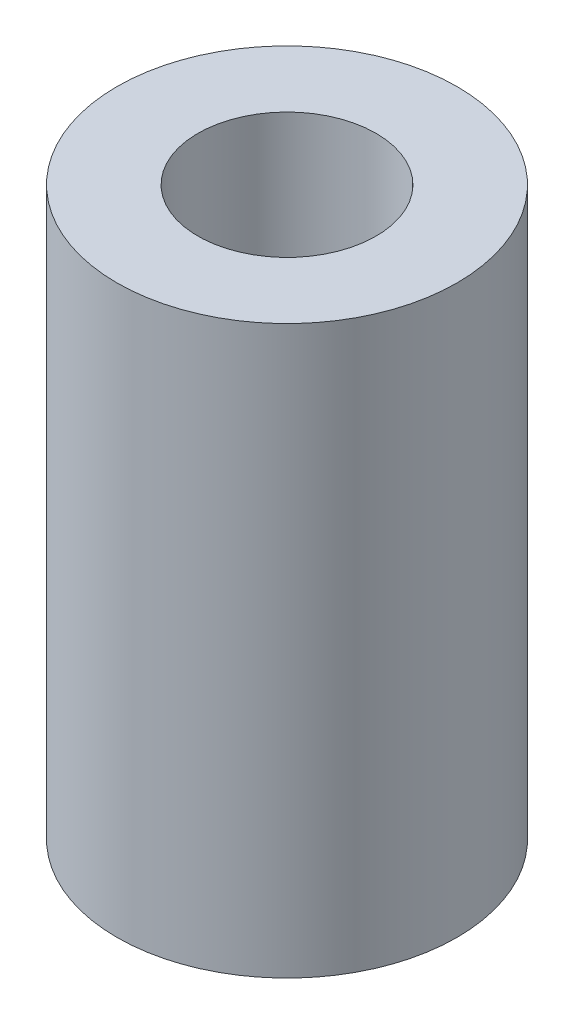
ISO-10303-21;
HEADER;
FILE_DESCRIPTION(('STEP AP214'),'2;1');
FILE_NAME('part.step','',(''),(''),'','','');
FILE_SCHEMA(('AUTOMOTIVE_DESIGN { 1 0 10303 214 1 1 1 1 }'));
ENDSEC;
DATA;
#1=APPLICATION_CONTEXT('core data for automotive mechanical design processes');
#2=APPLICATION_PROTOCOL_DEFINITION('international standard','automotive_design',2000,#1);
#3=PRODUCT_CONTEXT('',#1,'mechanical');
#4=PRODUCT('Part','Part','',(#3));
#5=PRODUCT_RELATED_PRODUCT_CATEGORY('part','',(#4));
#6=PRODUCT_DEFINITION_FORMATION('','',#4);
#7=PRODUCT_DEFINITION_CONTEXT('part definition',#1,'design');
#8=PRODUCT_DEFINITION('design','',#6,#7);
#9=PRODUCT_DEFINITION_SHAPE('','',#8);
#10=(LENGTH_UNIT() NAMED_UNIT(*) SI_UNIT(.MILLI.,.METRE.));
#11=(NAMED_UNIT(*) PLANE_ANGLE_UNIT() SI_UNIT($,.RADIAN.));
#12=(NAMED_UNIT(*) SI_UNIT($,.STERADIAN.) SOLID_ANGLE_UNIT());
#13=UNCERTAINTY_MEASURE_WITH_UNIT(LENGTH_MEASURE(1.E-05),#10,'distance_accuracy_value','');
#14=(GEOMETRIC_REPRESENTATION_CONTEXT(3) GLOBAL_UNCERTAINTY_ASSIGNED_CONTEXT((#13)) GLOBAL_UNIT_ASSIGNED_CONTEXT((#10,
#11,#12)) REPRESENTATION_CONTEXT('',''));
#15=CARTESIAN_POINT('',(0.,0.,0.));
#16=DIRECTION('',(0.,0.,1.));
#17=DIRECTION('',(1.,0.,0.));
#18=AXIS2_PLACEMENT_3D('',#15,#16,#17);
#19=CARTESIAN_POINT('',(0.,10.5,0.));
#20=DIRECTION('',(0.,1.,0.));
#21=DIRECTION('',(0.,0.,1.));
#22=AXIS2_PLACEMENT_3D('',#19,#20,#21);
#23=PLANE('',#22);
#24=CARTESIAN_POINT('',(0.,10.5,0.));
#25=DIRECTION('',(0.,1.,0.));
#26=DIRECTION('',(0.,0.,1.));
#27=AXIS2_PLACEMENT_3D('',#24,#25,#26);
#28=CIRCLE('',#27,3.15);
#29=CARTESIAN_POINT('',(0.,10.5,-3.15));
#30=VERTEX_POINT('',#29);
#31=EDGE_CURVE('E10',#30,#30,#28,.T.);
#32=ORIENTED_EDGE('',*,*,#31,.T.);
#33=EDGE_LOOP('',(#32));
#34=FACE_BOUND('',#33,.T.);
#35=CARTESIAN_POINT('',(0.,10.5,0.));
#36=DIRECTION('',(0.,1.,0.));
#37=DIRECTION('',(0.,0.,1.));
#38=AXIS2_PLACEMENT_3D('',#35,#36,#37);
#39=CIRCLE('',#38,1.65);
#40=CARTESIAN_POINT('',(0.,10.5,-1.65));
#41=VERTEX_POINT('',#40);
#42=EDGE_CURVE('E44',#41,#41,#39,.T.);
#43=ORIENTED_EDGE('',*,*,#42,.F.);
#44=EDGE_LOOP('',(#43));
#45=FACE_BOUND('',#44,.T.);
#46=ADVANCED_FACE('F33',(#34,#45),#23,.T.);
#47=CARTESIAN_POINT('',(0.,0.,0.));
#48=DIRECTION('',(0.,1.,0.));
#49=DIRECTION('',(0.,0.,1.));
#50=AXIS2_PLACEMENT_3D('',#47,#48,#49);
#51=PLANE('',#50);
#52=CARTESIAN_POINT('',(0.,0.,0.));
#53=DIRECTION('',(0.,1.,0.));
#54=DIRECTION('',(0.,0.,1.));
#55=AXIS2_PLACEMENT_3D('',#52,#53,#54);
#56=CIRCLE('',#55,3.15);
#57=CARTESIAN_POINT('',(0.,0.,-3.15));
#58=VERTEX_POINT('',#57);
#59=EDGE_CURVE('E37',#58,#58,#56,.T.);
#60=ORIENTED_EDGE('',*,*,#59,.F.);
#61=EDGE_LOOP('',(#60));
#62=FACE_BOUND('',#61,.T.);
#63=CARTESIAN_POINT('',(0.,0.,0.));
#64=DIRECTION('',(0.,1.,0.));
#65=DIRECTION('',(0.,0.,1.));
#66=AXIS2_PLACEMENT_3D('',#63,#64,#65);
#67=CIRCLE('',#66,1.65);
#68=CARTESIAN_POINT('',(0.,0.,-1.65));
#69=VERTEX_POINT('',#68);
#70=EDGE_CURVE('E46',#69,#69,#67,.T.);
#71=ORIENTED_EDGE('',*,*,#70,.T.);
#72=EDGE_LOOP('',(#71));
#73=FACE_BOUND('',#72,.T.);
#74=ADVANCED_FACE('F56',(#62,#73),#51,.F.);
#75=CARTESIAN_POINT('',(0.,10.5,0.));
#76=DIRECTION('',(0.,-1.,0.));
#77=DIRECTION('',(0.,0.,-1.));
#78=AXIS2_PLACEMENT_3D('',#75,#76,#77);
#79=CYLINDRICAL_SURFACE('',#78,3.15);
#80=CARTESIAN_POINT('',(0.,10.5,-3.15));
#81=CARTESIAN_POINT('',(0.,10.390625,-3.15));
#82=CARTESIAN_POINT('',(0.,10.28125,-3.15));
#83=CARTESIAN_POINT('',(0.,10.0625,-3.15));
#84=CARTESIAN_POINT('',(0.,9.953125,-3.15));
#85=CARTESIAN_POINT('',(0.,9.734375,-3.15));
#86=CARTESIAN_POINT('',(0.,9.625,-3.15));
#87=CARTESIAN_POINT('',(0.,9.40625,-3.15));
#88=CARTESIAN_POINT('',(0.,9.296875,-3.15));
#89=CARTESIAN_POINT('',(0.,9.078125,-3.15));
#90=CARTESIAN_POINT('',(0.,8.96875,-3.15));
#91=CARTESIAN_POINT('',(0.,8.75,-3.15));
#92=CARTESIAN_POINT('',(0.,8.640625,-3.15));
#93=CARTESIAN_POINT('',(0.,8.421875,-3.15));
#94=CARTESIAN_POINT('',(0.,8.3125,-3.15));
#95=CARTESIAN_POINT('',(0.,8.09375,-3.15));
#96=CARTESIAN_POINT('',(0.,7.984375,-3.15));
#97=CARTESIAN_POINT('',(0.,7.765625,-3.15));
#98=CARTESIAN_POINT('',(0.,7.65625,-3.15));
#99=CARTESIAN_POINT('',(0.,7.4375,-3.15));
#100=CARTESIAN_POINT('',(0.,7.328125,-3.15));
#101=CARTESIAN_POINT('',(0.,7.109375,-3.15));
#102=CARTESIAN_POINT('',(0.,7.,-3.15));
#103=CARTESIAN_POINT('',(0.,6.78125,-3.15));
#104=CARTESIAN_POINT('',(0.,6.671875,-3.15));
#105=CARTESIAN_POINT('',(0.,6.453125,-3.15));
#106=CARTESIAN_POINT('',(0.,6.34375,-3.15));
#107=CARTESIAN_POINT('',(0.,6.125,-3.15));
#108=CARTESIAN_POINT('',(0.,6.015625,-3.15));
#109=CARTESIAN_POINT('',(0.,5.796875,-3.15));
#110=CARTESIAN_POINT('',(0.,5.6875,-3.15));
#111=CARTESIAN_POINT('',(0.,5.46875,-3.15));
#112=CARTESIAN_POINT('',(0.,5.359375,-3.15));
#113=CARTESIAN_POINT('',(0.,5.140625,-3.15));
#114=CARTESIAN_POINT('',(0.,5.03125,-3.15));
#115=CARTESIAN_POINT('',(0.,4.8125,-3.15));
#116=CARTESIAN_POINT('',(0.,4.703125,-3.15));
#117=CARTESIAN_POINT('',(0.,4.484375,-3.15));
#118=CARTESIAN_POINT('',(0.,4.375,-3.15));
#119=CARTESIAN_POINT('',(0.,4.15625,-3.15));
#120=CARTESIAN_POINT('',(0.,4.046875,-3.15));
#121=CARTESIAN_POINT('',(0.,3.828125,-3.15));
#122=CARTESIAN_POINT('',(0.,3.71875,-3.15));
#123=CARTESIAN_POINT('',(0.,3.5,-3.15));
#124=CARTESIAN_POINT('',(0.,3.390625,-3.15));
#125=CARTESIAN_POINT('',(0.,3.171875,-3.15));
#126=CARTESIAN_POINT('',(0.,3.0625,-3.15));
#127=CARTESIAN_POINT('',(0.,2.84375,-3.15));
#128=CARTESIAN_POINT('',(0.,2.734375,-3.15));
#129=CARTESIAN_POINT('',(0.,2.515625,-3.15));
#130=CARTESIAN_POINT('',(0.,2.40625,-3.15));
#131=CARTESIAN_POINT('',(0.,2.1875,-3.15));
#132=CARTESIAN_POINT('',(0.,2.078125,-3.15));
#133=CARTESIAN_POINT('',(0.,1.859375,-3.15));
#134=CARTESIAN_POINT('',(0.,1.75,-3.15));
#135=CARTESIAN_POINT('',(0.,1.53125,-3.15));
#136=CARTESIAN_POINT('',(0.,1.421875,-3.15));
#137=CARTESIAN_POINT('',(0.,1.203125,-3.15));
#138=CARTESIAN_POINT('',(0.,1.09375,-3.15));
#139=CARTESIAN_POINT('',(0.,0.875000000000001,-3.15));
#140=CARTESIAN_POINT('',(0.,0.765625000000001,-3.15));
#141=CARTESIAN_POINT('',(0.,0.546875,-3.15));
#142=CARTESIAN_POINT('',(0.,0.4375,-3.15));
#143=CARTESIAN_POINT('',(0.,0.21875,-3.15));
#144=CARTESIAN_POINT('',(0.,0.109375,-3.15));
#145=CARTESIAN_POINT('',(0.,0.,-3.15));
#146=B_SPLINE_CURVE_WITH_KNOTS('',3,(#80,#81,#82,#83,#84,#85,#86,#87,#88,#89,#90,#91,#92,#93,
#94,#95,#96,#97,#98,#99,#100,#101,#102,#103,#104,#105,#106,#107,#108,#109,#110,#111,#112,#113,
#114,#115,#116,#117,#118,#119,#120,#121,#122,#123,#124,#125,#126,#127,#128,#129,#130,#131,#132,
#133,#134,#135,#136,#137,#138,#139,#140,#141,#142,#143,#144,#145),.UNSPECIFIED.,.F.,.F.,(4,2,2,
2,2,2,2,2,2,2,2,2,2,2,2,2,2,2,2,2,2,2,2,2,2,2,2,2,2,2,2,2,4),(0.,0.328124999999999,
0.656249999999999,0.984374999999999,1.3125,1.640625,1.96875,2.296875,2.625,2.953125,3.28125,
3.609375,3.9375,4.265625,4.59375,4.921875,5.25,5.578125,5.90625,6.234375,6.5625,6.890625,
7.21875,7.546875,7.875,8.203125,8.53125,8.859375,9.1875,9.515625,9.84375,10.171875,10.5),.UNSPECIFIED.);
#147=EDGE_CURVE('BSEAM35',#30,#58,#146,.T.);
#148=ORIENTED_EDGE('',*,*,#31,.F.);
#149=ORIENTED_EDGE('',*,*,#59,.T.);
#150=ORIENTED_EDGE('',*,*,#147,.T.);
#151=ORIENTED_EDGE('',*,*,#147,.F.);
#152=EDGE_LOOP('',(#148,#150,#149,#151));
#153=FACE_BOUND('',#152,.T.);
#154=ADVANCED_FACE('F35',(#153),#79,.T.);
#155=CARTESIAN_POINT('',(0.,10.5,0.));
#156=DIRECTION('',(0.,-1.,0.));
#157=DIRECTION('',(0.,0.,-1.));
#158=AXIS2_PLACEMENT_3D('',#155,#156,#157);
#159=CYLINDRICAL_SURFACE('',#158,1.65);
#160=CARTESIAN_POINT('',(0.,10.5,-1.65));
#161=CARTESIAN_POINT('',(0.,10.390625,-1.65));
#162=CARTESIAN_POINT('',(0.,10.28125,-1.65));
#163=CARTESIAN_POINT('',(0.,10.0625,-1.65));
#164=CARTESIAN_POINT('',(0.,9.953125,-1.65));
#165=CARTESIAN_POINT('',(0.,9.734375,-1.65));
#166=CARTESIAN_POINT('',(0.,9.625,-1.65));
#167=CARTESIAN_POINT('',(0.,9.40625,-1.65));
#168=CARTESIAN_POINT('',(0.,9.296875,-1.65));
#169=CARTESIAN_POINT('',(0.,9.078125,-1.65));
#170=CARTESIAN_POINT('',(0.,8.96875,-1.65));
#171=CARTESIAN_POINT('',(0.,8.75,-1.65));
#172=CARTESIAN_POINT('',(0.,8.640625,-1.65));
#173=CARTESIAN_POINT('',(0.,8.421875,-1.65));
#174=CARTESIAN_POINT('',(0.,8.3125,-1.65));
#175=CARTESIAN_POINT('',(0.,8.09375,-1.65));
#176=CARTESIAN_POINT('',(0.,7.984375,-1.65));
#177=CARTESIAN_POINT('',(0.,7.765625,-1.65));
#178=CARTESIAN_POINT('',(0.,7.65625,-1.65));
#179=CARTESIAN_POINT('',(0.,7.4375,-1.65));
#180=CARTESIAN_POINT('',(0.,7.328125,-1.65));
#181=CARTESIAN_POINT('',(0.,7.109375,-1.65));
#182=CARTESIAN_POINT('',(0.,7.,-1.65));
#183=CARTESIAN_POINT('',(0.,6.78125,-1.65));
#184=CARTESIAN_POINT('',(0.,6.671875,-1.65));
#185=CARTESIAN_POINT('',(0.,6.453125,-1.65));
#186=CARTESIAN_POINT('',(0.,6.34375,-1.65));
#187=CARTESIAN_POINT('',(0.,6.125,-1.65));
#188=CARTESIAN_POINT('',(0.,6.015625,-1.65));
#189=CARTESIAN_POINT('',(0.,5.796875,-1.65));
#190=CARTESIAN_POINT('',(0.,5.6875,-1.65));
#191=CARTESIAN_POINT('',(0.,5.46875,-1.65));
#192=CARTESIAN_POINT('',(0.,5.359375,-1.65));
#193=CARTESIAN_POINT('',(0.,5.140625,-1.65));
#194=CARTESIAN_POINT('',(0.,5.03125,-1.65));
#195=CARTESIAN_POINT('',(0.,4.8125,-1.65));
#196=CARTESIAN_POINT('',(0.,4.703125,-1.65));
#197=CARTESIAN_POINT('',(0.,4.484375,-1.65));
#198=CARTESIAN_POINT('',(0.,4.375,-1.65));
#199=CARTESIAN_POINT('',(0.,4.15625,-1.65));
#200=CARTESIAN_POINT('',(0.,4.046875,-1.65));
#201=CARTESIAN_POINT('',(0.,3.828125,-1.65));
#202=CARTESIAN_POINT('',(0.,3.71875,-1.65));
#203=CARTESIAN_POINT('',(0.,3.5,-1.65));
#204=CARTESIAN_POINT('',(0.,3.390625,-1.65));
#205=CARTESIAN_POINT('',(0.,3.171875,-1.65));
#206=CARTESIAN_POINT('',(0.,3.0625,-1.65));
#207=CARTESIAN_POINT('',(0.,2.84375,-1.65));
#208=CARTESIAN_POINT('',(0.,2.734375,-1.65));
#209=CARTESIAN_POINT('',(0.,2.515625,-1.65));
#210=CARTESIAN_POINT('',(0.,2.40625,-1.65));
#211=CARTESIAN_POINT('',(0.,2.1875,-1.65));
#212=CARTESIAN_POINT('',(0.,2.078125,-1.65));
#213=CARTESIAN_POINT('',(0.,1.859375,-1.65));
#214=CARTESIAN_POINT('',(0.,1.75,-1.65));
#215=CARTESIAN_POINT('',(0.,1.53125,-1.65));
#216=CARTESIAN_POINT('',(0.,1.421875,-1.65));
#217=CARTESIAN_POINT('',(0.,1.203125,-1.65));
#218=CARTESIAN_POINT('',(0.,1.09375,-1.65));
#219=CARTESIAN_POINT('',(0.,0.875000000000001,-1.65));
#220=CARTESIAN_POINT('',(0.,0.765625000000001,-1.65));
#221=CARTESIAN_POINT('',(0.,0.546875,-1.65));
#222=CARTESIAN_POINT('',(0.,0.4375,-1.65));
#223=CARTESIAN_POINT('',(0.,0.21875,-1.65));
#224=CARTESIAN_POINT('',(0.,0.109375,-1.65));
#225=CARTESIAN_POINT('',(0.,0.,-1.65));
#226=B_SPLINE_CURVE_WITH_KNOTS('',3,(#160,#161,#162,#163,#164,#165,#166,#167,#168,#169,#170,
#171,#172,#173,#174,#175,#176,#177,#178,#179,#180,#181,#182,#183,#184,#185,#186,#187,#188,#189,
#190,#191,#192,#193,#194,#195,#196,#197,#198,#199,#200,#201,#202,#203,#204,#205,#206,#207,#208,
#209,#210,#211,#212,#213,#214,#215,#216,#217,#218,#219,#220,#221,#222,#223,#224,#225),
.UNSPECIFIED.,.F.,.F.,(4,2,2,2,2,2,2,2,2,2,2,2,2,2,2,2,2,2,2,2,2,2,2,2,2,2,2,2,2,2,2,2,4),(0.,
0.328124999999999,0.656249999999999,0.984374999999999,1.3125,1.640625,1.96875,2.296875,2.625,
2.953125,3.28125,3.609375,3.9375,4.265625,4.59375,4.921875,5.25,5.578125,5.90625,6.234375,
6.5625,6.890625,7.21875,7.546875,7.875,8.203125,8.53125,8.859375,9.1875,9.515625,9.84375,
10.171875,10.5),.UNSPECIFIED.);
#227=EDGE_CURVE('BSEAM52',#41,#69,#226,.T.);
#228=ORIENTED_EDGE('',*,*,#42,.T.);
#229=ORIENTED_EDGE('',*,*,#70,.F.);
#230=ORIENTED_EDGE('',*,*,#227,.T.);
#231=ORIENTED_EDGE('',*,*,#227,.F.);
#232=EDGE_LOOP('',(#228,#230,#229,#231));
#233=FACE_BOUND('',#232,.T.);
#234=ADVANCED_FACE('F52',(#233),#159,.F.);
#235=CLOSED_SHELL('',(#46,#74,#154,#234));
#236=MANIFOLD_SOLID_BREP('B2',#235);
#237=ADVANCED_BREP_SHAPE_REPRESENTATION('',(#18,#236),#14);
#238=SHAPE_DEFINITION_REPRESENTATION(#9,#237);
ENDSEC;
END-ISO-10303-21;
